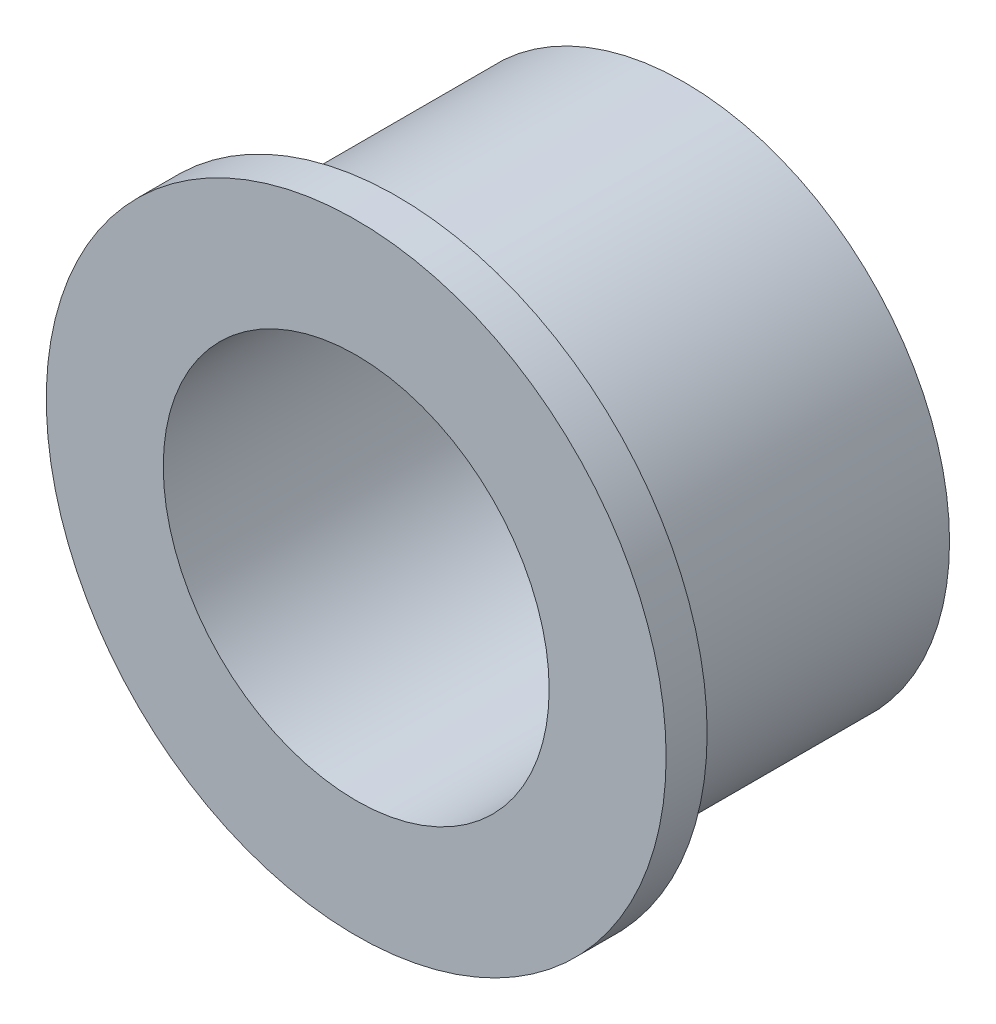
ISO-10303-21;
HEADER;
FILE_DESCRIPTION(('STEP AP214'),'2;1');
FILE_NAME('part.step','',(''),(''),'','','');
FILE_SCHEMA(('AUTOMOTIVE_DESIGN { 1 0 10303 214 1 1 1 1 }'));
ENDSEC;
DATA;
#1=APPLICATION_CONTEXT('core data for automotive mechanical design processes');
#2=APPLICATION_PROTOCOL_DEFINITION('international standard','automotive_design',2000,#1);
#3=PRODUCT_CONTEXT('',#1,'mechanical');
#4=PRODUCT('Part','Part','',(#3));
#5=PRODUCT_RELATED_PRODUCT_CATEGORY('part','',(#4));
#6=PRODUCT_DEFINITION_FORMATION('','',#4);
#7=PRODUCT_DEFINITION_CONTEXT('part definition',#1,'design');
#8=PRODUCT_DEFINITION('design','',#6,#7);
#9=PRODUCT_DEFINITION_SHAPE('','',#8);
#10=(LENGTH_UNIT() NAMED_UNIT(*) SI_UNIT(.MILLI.,.METRE.));
#11=(NAMED_UNIT(*) PLANE_ANGLE_UNIT() SI_UNIT($,.RADIAN.));
#12=(NAMED_UNIT(*) SI_UNIT($,.STERADIAN.) SOLID_ANGLE_UNIT());
#13=UNCERTAINTY_MEASURE_WITH_UNIT(LENGTH_MEASURE(1.E-05),#10,'distance_accuracy_value','');
#14=(GEOMETRIC_REPRESENTATION_CONTEXT(3) GLOBAL_UNCERTAINTY_ASSIGNED_CONTEXT((#13)) GLOBAL_UNIT_ASSIGNED_CONTEXT((#10,
#11,#12)) REPRESENTATION_CONTEXT('',''));
#15=CARTESIAN_POINT('',(0.,0.,0.));
#16=DIRECTION('',(0.,0.,1.));
#17=DIRECTION('',(1.,0.,0.));
#18=AXIS2_PLACEMENT_3D('',#15,#16,#17);
#19=CARTESIAN_POINT('',(0.,0.,-0.637547199136212));
#20=DIRECTION('',(0.,0.,1.));
#21=DIRECTION('',(1.,0.,0.));
#22=AXIS2_PLACEMENT_3D('',#19,#20,#21);
#23=CYLINDRICAL_SURFACE('',#22,1.95834);
#24=CARTESIAN_POINT('',(0.,0.,-0.637547199136212));
#25=DIRECTION('',(0.,0.,1.));
#26=DIRECTION('',(1.,0.,0.));
#27=AXIS2_PLACEMENT_3D('',#24,#25,#26);
#28=CIRCLE('',#27,1.95834);
#29=CARTESIAN_POINT('',(1.95834,0.,-0.637547199136212));
#30=VERTEX_POINT('',#29);
#31=EDGE_CURVE('E55',#30,#30,#28,.T.);
#32=ORIENTED_EDGE('',*,*,#31,.F.);
#33=EDGE_LOOP('',(#32));
#34=FACE_BOUND('',#33,.T.);
#35=CARTESIAN_POINT('',(0.,0.,-0.896627199136212));
#36=DIRECTION('',(0.,0.,1.));
#37=DIRECTION('',(1.,0.,0.));
#38=AXIS2_PLACEMENT_3D('',#35,#36,#37);
#39=CIRCLE('',#38,1.95834);
#40=CARTESIAN_POINT('',(1.95834,0.,-0.896627199136212));
#41=VERTEX_POINT('',#40);
#42=EDGE_CURVE('E10',#41,#41,#39,.T.);
#43=ORIENTED_EDGE('',*,*,#42,.T.);
#44=EDGE_LOOP('',(#43));
#45=FACE_BOUND('',#44,.T.);
#46=ADVANCED_FACE('F33',(#34,#45),#23,.T.);
#47=CARTESIAN_POINT('',(0.,1.95834,-0.896627199136212));
#48=DIRECTION('',(0.,0.,1.));
#49=DIRECTION('',(1.,0.,0.));
#50=AXIS2_PLACEMENT_3D('',#47,#48,#49);
#51=PLANE('',#50);
#52=ORIENTED_EDGE('',*,*,#42,.F.);
#53=EDGE_LOOP('',(#52));
#54=FACE_BOUND('',#53,.T.);
#55=CARTESIAN_POINT('',(0.,0.,-0.896627199136212));
#56=DIRECTION('',(0.,0.,1.));
#57=DIRECTION('',(1.,0.,0.));
#58=AXIS2_PLACEMENT_3D('',#55,#56,#57);
#59=CIRCLE('',#58,1.6764);
#60=CARTESIAN_POINT('',(1.6764,0.,-0.896627199136212));
#61=VERTEX_POINT('',#60);
#62=EDGE_CURVE('E39',#61,#61,#59,.T.);
#63=ORIENTED_EDGE('',*,*,#62,.T.);
#64=EDGE_LOOP('',(#63));
#65=FACE_BOUND('',#64,.T.);
#66=ADVANCED_FACE('F62',(#54,#65),#51,.F.);
#67=CARTESIAN_POINT('',(0.,0.,-0.637547199136212));
#68=DIRECTION('',(0.,0.,1.));
#69=DIRECTION('',(1.,0.,0.));
#70=AXIS2_PLACEMENT_3D('',#67,#68,#69);
#71=CYLINDRICAL_SURFACE('',#70,1.6764);
#72=ORIENTED_EDGE('',*,*,#62,.F.);
#73=EDGE_LOOP('',(#72));
#74=FACE_BOUND('',#73,.T.);
#75=CARTESIAN_POINT('',(0.,0.,-2.71018719913621));
#76=DIRECTION('',(0.,0.,1.));
#77=DIRECTION('',(1.,0.,0.));
#78=AXIS2_PLACEMENT_3D('',#75,#76,#77);
#79=CIRCLE('',#78,1.6764);
#80=CARTESIAN_POINT('',(1.6764,0.,-2.71018719913621));
#81=VERTEX_POINT('',#80);
#82=EDGE_CURVE('E43',#81,#81,#79,.T.);
#83=ORIENTED_EDGE('',*,*,#82,.T.);
#84=EDGE_LOOP('',(#83));
#85=FACE_BOUND('',#84,.T.);
#86=ADVANCED_FACE('F66',(#74,#85),#71,.T.);
#87=CARTESIAN_POINT('',(0.,1.6764,-2.71018719913621));
#88=DIRECTION('',(0.,0.,1.));
#89=DIRECTION('',(1.,0.,0.));
#90=AXIS2_PLACEMENT_3D('',#87,#88,#89);
#91=PLANE('',#90);
#92=ORIENTED_EDGE('',*,*,#82,.F.);
#93=EDGE_LOOP('',(#92));
#94=FACE_BOUND('',#93,.T.);
#95=CARTESIAN_POINT('',(0.,0.,-2.71018719913621));
#96=DIRECTION('',(0.,0.,1.));
#97=DIRECTION('',(1.,0.,0.));
#98=AXIS2_PLACEMENT_3D('',#95,#96,#97);
#99=CIRCLE('',#98,1.2192);
#100=CARTESIAN_POINT('',(1.2192,0.,-2.71018719913621));
#101=VERTEX_POINT('',#100);
#102=EDGE_CURVE('E47',#101,#101,#99,.T.);
#103=ORIENTED_EDGE('',*,*,#102,.T.);
#104=EDGE_LOOP('',(#103));
#105=FACE_BOUND('',#104,.T.);
#106=ADVANCED_FACE('F71',(#94,#105),#91,.F.);
#107=CARTESIAN_POINT('',(0.,0.,-0.637547199136212));
#108=DIRECTION('',(0.,0.,1.));
#109=DIRECTION('',(1.,0.,0.));
#110=AXIS2_PLACEMENT_3D('',#107,#108,#109);
#111=CYLINDRICAL_SURFACE('',#110,1.2192);
#112=ORIENTED_EDGE('',*,*,#102,.F.);
#113=EDGE_LOOP('',(#112));
#114=FACE_BOUND('',#113,.T.);
#115=CARTESIAN_POINT('',(0.,0.,-0.637547199136212));
#116=DIRECTION('',(0.,0.,1.));
#117=DIRECTION('',(1.,0.,0.));
#118=AXIS2_PLACEMENT_3D('',#115,#116,#117);
#119=CIRCLE('',#118,1.2192);
#120=CARTESIAN_POINT('',(1.2192,0.,-0.637547199136212));
#121=VERTEX_POINT('',#120);
#122=EDGE_CURVE('E52',#121,#121,#119,.T.);
#123=ORIENTED_EDGE('',*,*,#122,.T.);
#124=EDGE_LOOP('',(#123));
#125=FACE_BOUND('',#124,.T.);
#126=ADVANCED_FACE('F77',(#114,#125),#111,.F.);
#127=CARTESIAN_POINT('',(0.,1.2192,-0.637547199136212));
#128=DIRECTION('',(0.,0.,-1.));
#129=DIRECTION('',(-1.,0.,0.));
#130=AXIS2_PLACEMENT_3D('',#127,#128,#129);
#131=PLANE('',#130);
#132=ORIENTED_EDGE('',*,*,#122,.F.);
#133=EDGE_LOOP('',(#132));
#134=FACE_BOUND('',#133,.T.);
#135=ORIENTED_EDGE('',*,*,#31,.T.);
#136=EDGE_LOOP('',(#135));
#137=FACE_BOUND('',#136,.T.);
#138=ADVANCED_FACE('F59',(#134,#137),#131,.F.);
#139=CLOSED_SHELL('',(#46,#66,#86,#106,#126,#138));
#140=MANIFOLD_SOLID_BREP('B2',#139);
#141=ADVANCED_BREP_SHAPE_REPRESENTATION('',(#18,#140),#14);
#142=SHAPE_DEFINITION_REPRESENTATION(#9,#141);
ENDSEC;
END-ISO-10303-21;
